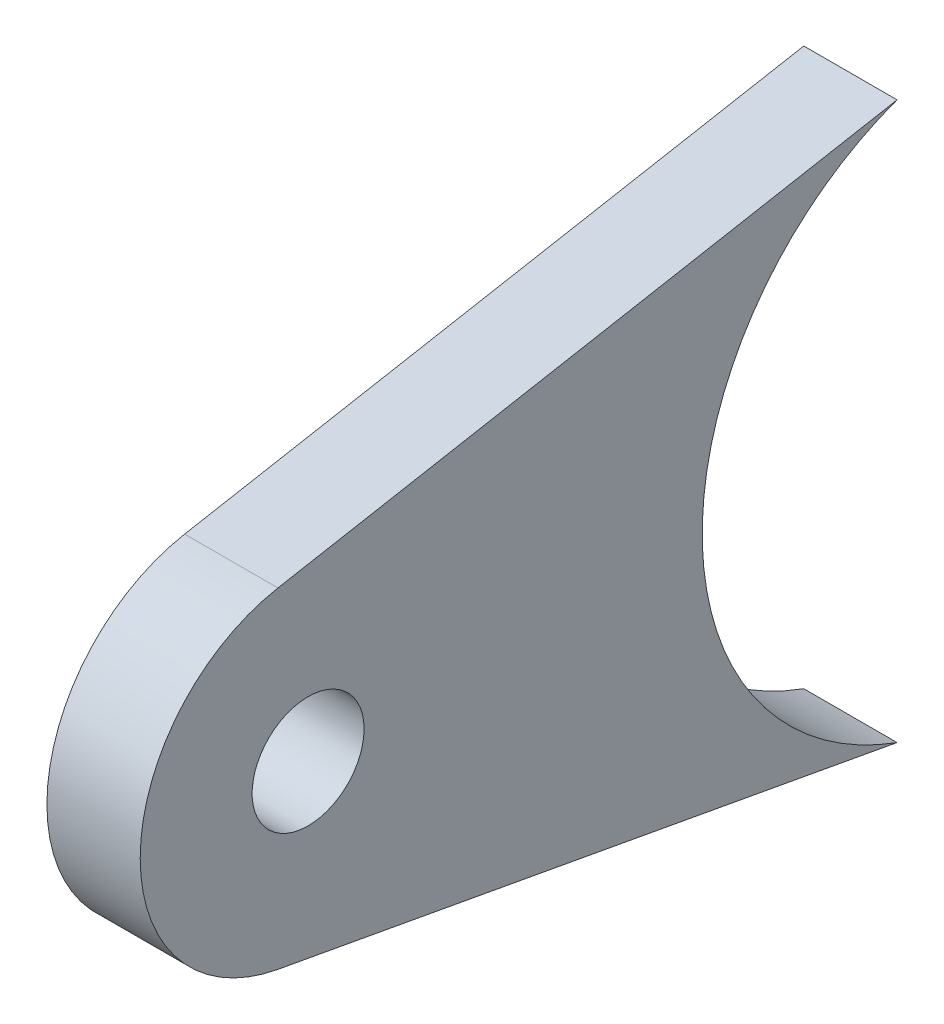
ISO-10303-21;
HEADER;
FILE_DESCRIPTION(('STEP AP214'),'2;1');
FILE_NAME('part.step','',(''),(''),'','','');
FILE_SCHEMA(('AUTOMOTIVE_DESIGN { 1 0 10303 214 1 1 1 1 }'));
ENDSEC;
DATA;
#1=APPLICATION_CONTEXT('core data for automotive mechanical design processes');
#2=APPLICATION_PROTOCOL_DEFINITION('international standard','automotive_design',2000,#1);
#3=PRODUCT_CONTEXT('',#1,'mechanical');
#4=PRODUCT('Part','Part','',(#3));
#5=PRODUCT_RELATED_PRODUCT_CATEGORY('part','',(#4));
#6=PRODUCT_DEFINITION_FORMATION('','',#4);
#7=PRODUCT_DEFINITION_CONTEXT('part definition',#1,'design');
#8=PRODUCT_DEFINITION('design','',#6,#7);
#9=PRODUCT_DEFINITION_SHAPE('','',#8);
#10=(LENGTH_UNIT() NAMED_UNIT(*) SI_UNIT(.MILLI.,.METRE.));
#11=(NAMED_UNIT(*) PLANE_ANGLE_UNIT() SI_UNIT($,.RADIAN.));
#12=(NAMED_UNIT(*) SI_UNIT($,.STERADIAN.) SOLID_ANGLE_UNIT());
#13=UNCERTAINTY_MEASURE_WITH_UNIT(LENGTH_MEASURE(1.E-05),#10,'distance_accuracy_value','');
#14=(GEOMETRIC_REPRESENTATION_CONTEXT(3) GLOBAL_UNCERTAINTY_ASSIGNED_CONTEXT((#13)) GLOBAL_UNIT_ASSIGNED_CONTEXT((#10,
#11,#12)) REPRESENTATION_CONTEXT('',''));
#15=CARTESIAN_POINT('',(0.,0.,0.));
#16=DIRECTION('',(0.,0.,1.));
#17=DIRECTION('',(1.,0.,0.));
#18=AXIS2_PLACEMENT_3D('',#15,#16,#17);
#19=CARTESIAN_POINT('',(2.5,0.,0.));
#20=DIRECTION('',(1.,0.,0.));
#21=DIRECTION('',(0.,0.,-1.));
#22=AXIS2_PLACEMENT_3D('',#19,#20,#21);
#23=PLANE('',#22);
#24=CARTESIAN_POINT('',(2.5,0.,0.));
#25=DIRECTION('',(-1.,0.,0.));
#26=DIRECTION('',(0.,0.,-1.));
#27=AXIS2_PLACEMENT_3D('',#24,#25,#26);
#28=CIRCLE('',#27,15.875);
#29=CARTESIAN_POINT('',(2.5,-14.9176203549763,5.4295697752949));
#30=VERTEX_POINT('',#29);
#31=CARTESIAN_POINT('',(2.5,14.9176203549763,5.4295697752949));
#32=VERTEX_POINT('',#31);
#33=EDGE_CURVE('E91',#30,#32,#28,.T.);
#34=ORIENTED_EDGE('',*,*,#33,.T.);
#35=DIRECTION('',(0.,-0.17974598100163,0.983713058932208));
#36=VECTOR('',#35,1.);
#37=CARTESIAN_POINT('',(2.5,14.9176203549763,5.4295697752949));
#38=LINE('',#37,#36);
#39=CARTESIAN_POINT('',(2.5,8.85341753038987,38.6177138290147));
#40=VERTEX_POINT('',#39);
#41=EDGE_CURVE('E86',#32,#40,#38,.T.);
#42=ORIENTED_EDGE('',*,*,#41,.T.);
#43=CARTESIAN_POINT('',(2.5,0.,37.));
#44=DIRECTION('',(1.,0.,0.));
#45=DIRECTION('',(0.,0.,-1.));
#46=AXIS2_PLACEMENT_3D('',#43,#44,#45);
#47=CIRCLE('',#46,9.);
#48=CARTESIAN_POINT('',(2.5,-8.85341753038987,38.6177138290147));
#49=VERTEX_POINT('',#48);
#50=EDGE_CURVE('E89',#40,#49,#47,.T.);
#51=ORIENTED_EDGE('',*,*,#50,.T.);
#52=DIRECTION('',(0.,-0.17974598100163,-0.983713058932208));
#53=VECTOR('',#52,1.);
#54=CARTESIAN_POINT('',(2.5,-14.9176203549763,5.4295697752949));
#55=LINE('',#54,#53);
#56=EDGE_CURVE('E56',#49,#30,#55,.T.);
#57=ORIENTED_EDGE('',*,*,#56,.T.);
#58=EDGE_LOOP('',(#34,#42,#51,#57));
#59=FACE_BOUND('',#58,.T.);
#60=CARTESIAN_POINT('',(2.5,0.,37.));
#61=DIRECTION('',(1.,0.,0.));
#62=DIRECTION('',(0.,0.,-1.));
#63=AXIS2_PLACEMENT_3D('',#60,#61,#62);
#64=CIRCLE('',#63,3.);
#65=CARTESIAN_POINT('',(2.5,0.,34.));
#66=VERTEX_POINT('',#65);
#67=EDGE_CURVE('E106',#66,#66,#64,.T.);
#68=ORIENTED_EDGE('',*,*,#67,.F.);
#69=EDGE_LOOP('',(#68));
#70=FACE_BOUND('',#69,.T.);
#71=ADVANCED_FACE('F39',(#59,#70),#23,.T.);
#72=CARTESIAN_POINT('',(-2.5,0.,0.));
#73=DIRECTION('',(1.,0.,0.));
#74=DIRECTION('',(0.,0.,-1.));
#75=AXIS2_PLACEMENT_3D('',#72,#73,#74);
#76=PLANE('',#75);
#77=CARTESIAN_POINT('',(-2.5,0.,0.));
#78=DIRECTION('',(-1.,0.,0.));
#79=DIRECTION('',(0.,0.,-1.));
#80=AXIS2_PLACEMENT_3D('',#77,#78,#79);
#81=CIRCLE('',#80,15.875);
#82=CARTESIAN_POINT('',(-2.5,-14.9176203549763,5.4295697752949));
#83=VERTEX_POINT('',#82);
#84=CARTESIAN_POINT('',(-2.5,14.9176203549763,5.4295697752949));
#85=VERTEX_POINT('',#84);
#86=EDGE_CURVE('E103',#83,#85,#81,.T.);
#87=ORIENTED_EDGE('',*,*,#86,.F.);
#88=DIRECTION('',(0.,-0.17974598100163,-0.983713058932208));
#89=VECTOR('',#88,1.);
#90=CARTESIAN_POINT('',(-2.5,-14.9176203549763,5.4295697752949));
#91=LINE('',#90,#89);
#92=CARTESIAN_POINT('',(-2.5,-8.85341753038987,38.6177138290147));
#93=VERTEX_POINT('',#92);
#94=EDGE_CURVE('E79',#93,#83,#91,.T.);
#95=ORIENTED_EDGE('',*,*,#94,.F.);
#96=CARTESIAN_POINT('',(-2.5,0.,37.));
#97=DIRECTION('',(1.,0.,0.));
#98=DIRECTION('',(0.,0.,-1.));
#99=AXIS2_PLACEMENT_3D('',#96,#97,#98);
#100=CIRCLE('',#99,9.);
#101=CARTESIAN_POINT('',(-2.5,8.85341753038987,38.6177138290147));
#102=VERTEX_POINT('',#101);
#103=EDGE_CURVE('E73',#102,#93,#100,.T.);
#104=ORIENTED_EDGE('',*,*,#103,.F.);
#105=DIRECTION('',(0.,-0.17974598100163,0.983713058932208));
#106=VECTOR('',#105,1.);
#107=CARTESIAN_POINT('',(-2.5,14.9176203549763,5.4295697752949));
#108=LINE('',#107,#106);
#109=EDGE_CURVE('E95',#85,#102,#108,.T.);
#110=ORIENTED_EDGE('',*,*,#109,.F.);
#111=EDGE_LOOP('',(#87,#95,#104,#110));
#112=FACE_BOUND('',#111,.T.);
#113=CARTESIAN_POINT('',(-2.5,0.,37.));
#114=DIRECTION('',(1.,0.,0.));
#115=DIRECTION('',(0.,0.,-1.));
#116=AXIS2_PLACEMENT_3D('',#113,#114,#115);
#117=CIRCLE('',#116,3.);
#118=CARTESIAN_POINT('',(-2.5,0.,34.));
#119=VERTEX_POINT('',#118);
#120=EDGE_CURVE('E118',#119,#119,#117,.T.);
#121=ORIENTED_EDGE('',*,*,#120,.T.);
#122=EDGE_LOOP('',(#121));
#123=FACE_BOUND('',#122,.T.);
#124=ADVANCED_FACE('F114',(#112,#123),#76,.F.);
#125=CARTESIAN_POINT('',(2.5,0.,0.));
#126=DIRECTION('',(-1.,0.,0.));
#127=DIRECTION('',(0.,0.,1.));
#128=AXIS2_PLACEMENT_3D('',#125,#126,#127);
#129=CYLINDRICAL_SURFACE('',#128,15.875);
#130=ORIENTED_EDGE('',*,*,#86,.T.);
#131=DIRECTION('',(-1.,0.,0.));
#132=VECTOR('',#131,1.);
#133=CARTESIAN_POINT('',(2.5,14.9176203549763,5.4295697752949));
#134=LINE('',#133,#132);
#135=EDGE_CURVE('E11',#32,#85,#134,.T.);
#136=ORIENTED_EDGE('',*,*,#135,.F.);
#137=ORIENTED_EDGE('',*,*,#33,.F.);
#138=DIRECTION('',(-1.,0.,0.));
#139=VECTOR('',#138,1.);
#140=CARTESIAN_POINT('',(2.5,-14.9176203549763,5.4295697752949));
#141=LINE('',#140,#139);
#142=EDGE_CURVE('E99',#30,#83,#141,.T.);
#143=ORIENTED_EDGE('',*,*,#142,.T.);
#144=EDGE_LOOP('',(#130,#136,#137,#143));
#145=FACE_BOUND('',#144,.T.);
#146=ADVANCED_FACE('F41',(#145),#129,.F.);
#147=CARTESIAN_POINT('',(2.5,14.9176203549763,5.4295697752949));
#148=DIRECTION('',(0.,-0.983713058932208,-0.17974598100163));
#149=DIRECTION('',(0.,0.17974598100163,-0.983713058932208));
#150=AXIS2_PLACEMENT_3D('',#147,#148,#149);
#151=PLANE('',#150);
#152=ORIENTED_EDGE('',*,*,#109,.T.);
#153=DIRECTION('',(-1.,0.,0.));
#154=VECTOR('',#153,1.);
#155=CARTESIAN_POINT('',(2.5,8.85341753038987,38.6177138290147));
#156=LINE('',#155,#154);
#157=EDGE_CURVE('E48',#40,#102,#156,.T.);
#158=ORIENTED_EDGE('',*,*,#157,.F.);
#159=ORIENTED_EDGE('',*,*,#41,.F.);
#160=ORIENTED_EDGE('',*,*,#135,.T.);
#161=EDGE_LOOP('',(#152,#158,#159,#160));
#162=FACE_BOUND('',#161,.T.);
#163=ADVANCED_FACE('F94',(#162),#151,.F.);
#164=CARTESIAN_POINT('',(2.5,0.,37.));
#165=DIRECTION('',(-1.,0.,0.));
#166=DIRECTION('',(0.,0.,1.));
#167=AXIS2_PLACEMENT_3D('',#164,#165,#166);
#168=CYLINDRICAL_SURFACE('',#167,9.);
#169=ORIENTED_EDGE('',*,*,#103,.T.);
#170=DIRECTION('',(-1.,0.,0.));
#171=VECTOR('',#170,1.);
#172=CARTESIAN_POINT('',(2.5,-8.85341753038987,38.6177138290147));
#173=LINE('',#172,#171);
#174=EDGE_CURVE('E96',#49,#93,#173,.T.);
#175=ORIENTED_EDGE('',*,*,#174,.F.);
#176=ORIENTED_EDGE('',*,*,#50,.F.);
#177=ORIENTED_EDGE('',*,*,#157,.T.);
#178=EDGE_LOOP('',(#169,#175,#176,#177));
#179=FACE_BOUND('',#178,.T.);
#180=ADVANCED_FACE('F97',(#179),#168,.T.);
#181=CARTESIAN_POINT('',(2.5,-14.9176203549763,5.4295697752949));
#182=DIRECTION('',(0.,0.983713058932208,-0.17974598100163));
#183=DIRECTION('',(0.,0.17974598100163,0.983713058932208));
#184=AXIS2_PLACEMENT_3D('',#181,#182,#183);
#185=PLANE('',#184);
#186=ORIENTED_EDGE('',*,*,#94,.T.);
#187=ORIENTED_EDGE('',*,*,#142,.F.);
#188=ORIENTED_EDGE('',*,*,#56,.F.);
#189=ORIENTED_EDGE('',*,*,#174,.T.);
#190=EDGE_LOOP('',(#186,#187,#188,#189));
#191=FACE_BOUND('',#190,.T.);
#192=ADVANCED_FACE('F111',(#191),#185,.F.);
#193=CARTESIAN_POINT('',(2.5,0.,37.));
#194=DIRECTION('',(-1.,0.,0.));
#195=DIRECTION('',(0.,0.,1.));
#196=AXIS2_PLACEMENT_3D('',#193,#194,#195);
#197=CYLINDRICAL_SURFACE('',#196,3.);
#198=ORIENTED_EDGE('',*,*,#67,.T.);
#199=EDGE_LOOP('',(#198));
#200=FACE_BOUND('',#199,.T.);
#201=ORIENTED_EDGE('',*,*,#120,.F.);
#202=EDGE_LOOP('',(#201));
#203=FACE_BOUND('',#202,.T.);
#204=ADVANCED_FACE('F124',(#200,#203),#197,.F.);
#205=CLOSED_SHELL('',(#71,#124,#146,#163,#180,#192,#204));
#206=MANIFOLD_SOLID_BREP('B2',#205);
#207=ADVANCED_BREP_SHAPE_REPRESENTATION('',(#18,#206),#14);
#208=SHAPE_DEFINITION_REPRESENTATION(#9,#207);
ENDSEC;
END-ISO-10303-21;
